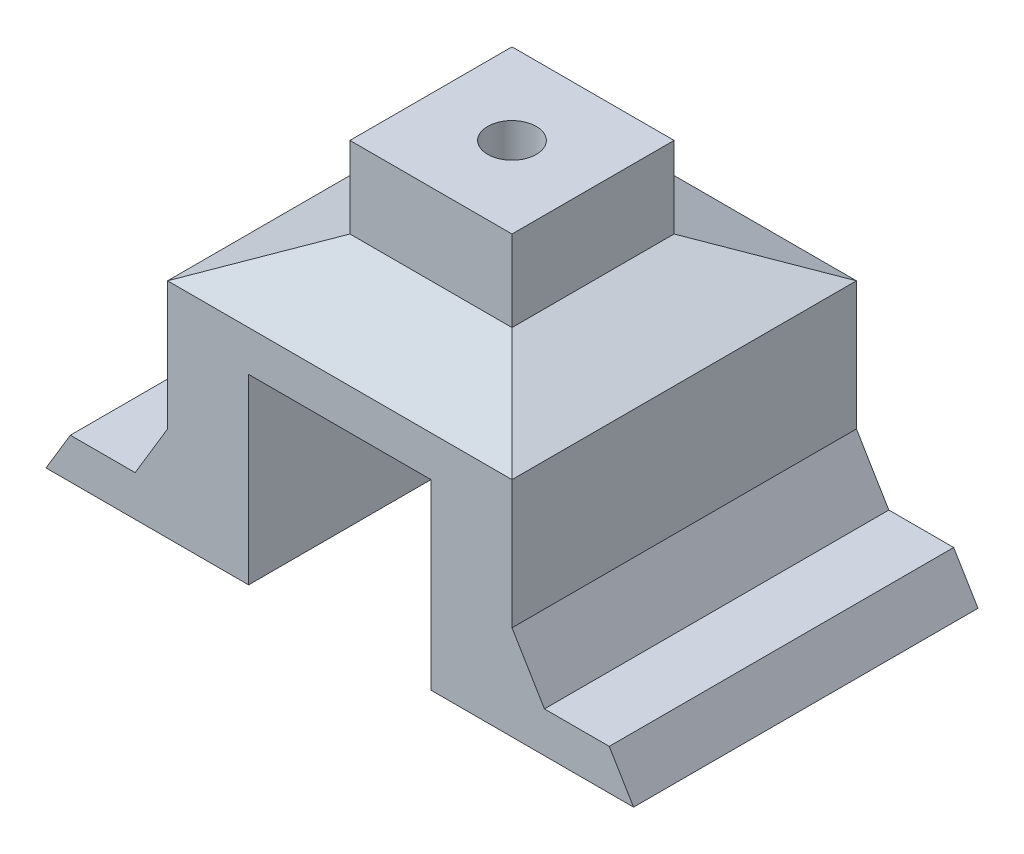
ISO-10303-21;
HEADER;
FILE_DESCRIPTION(('STEP AP214'),'2;1');
FILE_NAME('part.step','',(''),(''),'','','');
FILE_SCHEMA(('AUTOMOTIVE_DESIGN { 1 0 10303 214 1 1 1 1 }'));
ENDSEC;
DATA;
#1=APPLICATION_CONTEXT('core data for automotive mechanical design processes');
#2=APPLICATION_PROTOCOL_DEFINITION('international standard','automotive_design',2000,#1);
#3=PRODUCT_CONTEXT('',#1,'mechanical');
#4=PRODUCT('Part','Part','',(#3));
#5=PRODUCT_RELATED_PRODUCT_CATEGORY('part','',(#4));
#6=PRODUCT_DEFINITION_FORMATION('','',#4);
#7=PRODUCT_DEFINITION_CONTEXT('part definition',#1,'design');
#8=PRODUCT_DEFINITION('design','',#6,#7);
#9=PRODUCT_DEFINITION_SHAPE('','',#8);
#10=(LENGTH_UNIT() NAMED_UNIT(*) SI_UNIT(.MILLI.,.METRE.));
#11=(NAMED_UNIT(*) PLANE_ANGLE_UNIT() SI_UNIT($,.RADIAN.));
#12=(NAMED_UNIT(*) SI_UNIT($,.STERADIAN.) SOLID_ANGLE_UNIT());
#13=UNCERTAINTY_MEASURE_WITH_UNIT(LENGTH_MEASURE(1.E-05),#10,'distance_accuracy_value','');
#14=(GEOMETRIC_REPRESENTATION_CONTEXT(3) GLOBAL_UNCERTAINTY_ASSIGNED_CONTEXT((#13)) GLOBAL_UNIT_ASSIGNED_CONTEXT((#10,
#11,#12)) REPRESENTATION_CONTEXT('',''));
#15=CARTESIAN_POINT('',(0.,0.,0.));
#16=DIRECTION('',(0.,0.,1.));
#17=DIRECTION('',(1.,0.,0.));
#18=AXIS2_PLACEMENT_3D('',#15,#16,#17);
#19=CARTESIAN_POINT('',(-36.25,0.,21.25));
#20=DIRECTION('',(0.,1.,0.));
#21=DIRECTION('',(-1.,0.,0.));
#22=AXIS2_PLACEMENT_3D('',#19,#20,#21);
#23=PLANE('',#22);
#24=DIRECTION('',(1.,0.,0.));
#25=VECTOR('',#24,1.);
#26=CARTESIAN_POINT('',(-36.25,0.,-21.25));
#27=LINE('',#26,#25);
#28=CARTESIAN_POINT('',(-36.25,0.,-21.25));
#29=VERTEX_POINT('',#28);
#30=CARTESIAN_POINT('',(-11.25,0.,-21.25));
#31=VERTEX_POINT('',#30);
#32=EDGE_CURVE('E174',#29,#31,#27,.T.);
#33=ORIENTED_EDGE('',*,*,#32,.T.);
#34=DIRECTION('',(0.,0.,-1.));
#35=VECTOR('',#34,1.);
#36=CARTESIAN_POINT('',(-11.25,0.,21.25));
#37=LINE('',#36,#35);
#38=CARTESIAN_POINT('',(-11.25,0.,21.25));
#39=VERTEX_POINT('',#38);
#40=EDGE_CURVE('E272',#39,#31,#37,.T.);
#41=ORIENTED_EDGE('',*,*,#40,.F.);
#42=DIRECTION('',(1.,0.,0.));
#43=VECTOR('',#42,1.);
#44=CARTESIAN_POINT('',(-36.25,0.,21.25));
#45=LINE('',#44,#43);
#46=CARTESIAN_POINT('',(-36.25,0.,21.25));
#47=VERTEX_POINT('',#46);
#48=EDGE_CURVE('E213',#47,#39,#45,.T.);
#49=ORIENTED_EDGE('',*,*,#48,.F.);
#50=DIRECTION('',(0.,0.,-1.));
#51=VECTOR('',#50,1.);
#52=CARTESIAN_POINT('',(-36.25,0.,21.25));
#53=LINE('',#52,#51);
#54=EDGE_CURVE('E170',#47,#29,#53,.T.);
#55=ORIENTED_EDGE('',*,*,#54,.T.);
#56=EDGE_LOOP('',(#33,#41,#49,#55));
#57=FACE_BOUND('',#56,.T.);
#58=ADVANCED_FACE('F38',(#57),#23,.F.);
#59=CARTESIAN_POINT('',(-11.25,0.,21.25));
#60=DIRECTION('',(-1.,0.,0.));
#61=DIRECTION('',(0.,0.,1.));
#62=AXIS2_PLACEMENT_3D('',#59,#60,#61);
#63=PLANE('',#62);
#64=DIRECTION('',(0.,1.,0.));
#65=VECTOR('',#64,1.);
#66=CARTESIAN_POINT('',(-11.25,0.,-21.25));
#67=LINE('',#66,#65);
#68=CARTESIAN_POINT('',(-11.25,22.5,-21.25));
#69=VERTEX_POINT('',#68);
#70=EDGE_CURVE('E178',#31,#69,#67,.T.);
#71=ORIENTED_EDGE('',*,*,#70,.T.);
#72=DIRECTION('',(0.,0.,-1.));
#73=VECTOR('',#72,1.);
#74=CARTESIAN_POINT('',(-11.25,22.5,21.25));
#75=LINE('',#74,#73);
#76=CARTESIAN_POINT('',(-11.25,22.5,21.25));
#77=VERTEX_POINT('',#76);
#78=EDGE_CURVE('E268',#77,#69,#75,.T.);
#79=ORIENTED_EDGE('',*,*,#78,.F.);
#80=DIRECTION('',(0.,1.,0.));
#81=VECTOR('',#80,1.);
#82=CARTESIAN_POINT('',(-11.25,0.,21.25));
#83=LINE('',#82,#81);
#84=EDGE_CURVE('E115',#39,#77,#83,.T.);
#85=ORIENTED_EDGE('',*,*,#84,.F.);
#86=ORIENTED_EDGE('',*,*,#40,.T.);
#87=EDGE_LOOP('',(#71,#79,#85,#86));
#88=FACE_BOUND('',#87,.T.);
#89=ADVANCED_FACE('F430',(#88),#63,.F.);
#90=CARTESIAN_POINT('',(-11.25,22.5,21.25));
#91=DIRECTION('',(0.,1.,0.));
#92=DIRECTION('',(0.,0.,1.));
#93=AXIS2_PLACEMENT_3D('',#90,#91,#92);
#94=PLANE('',#93);
#95=CARTESIAN_POINT('',(0.,22.5,0.));
#96=DIRECTION('',(0.,1.,0.));
#97=DIRECTION('',(0.,0.,1.));
#98=AXIS2_PLACEMENT_3D('',#95,#96,#97);
#99=CIRCLE('',#98,3.);
#100=CARTESIAN_POINT('',(0.,22.5,3.));
#101=VERTEX_POINT('',#100);
#102=EDGE_CURVE('E325',#101,#101,#99,.T.);
#103=ORIENTED_EDGE('',*,*,#102,.T.);
#104=EDGE_LOOP('',(#103));
#105=FACE_BOUND('',#104,.T.);
#106=DIRECTION('',(1.,0.,0.));
#107=VECTOR('',#106,1.);
#108=CARTESIAN_POINT('',(-11.25,22.5,-21.25));
#109=LINE('',#108,#107);
#110=CARTESIAN_POINT('',(11.25,22.5,-21.25));
#111=VERTEX_POINT('',#110);
#112=EDGE_CURVE('E182',#69,#111,#109,.T.);
#113=ORIENTED_EDGE('',*,*,#112,.T.);
#114=DIRECTION('',(0.,0.,-1.));
#115=VECTOR('',#114,1.);
#116=CARTESIAN_POINT('',(11.25,22.5,21.25));
#117=LINE('',#116,#115);
#118=CARTESIAN_POINT('',(11.25,22.5,21.25));
#119=VERTEX_POINT('',#118);
#120=EDGE_CURVE('E264',#119,#111,#117,.T.);
#121=ORIENTED_EDGE('',*,*,#120,.F.);
#122=DIRECTION('',(1.,0.,0.));
#123=VECTOR('',#122,1.);
#124=CARTESIAN_POINT('',(-11.25,22.5,21.25));
#125=LINE('',#124,#123);
#126=EDGE_CURVE('E351',#77,#119,#125,.T.);
#127=ORIENTED_EDGE('',*,*,#126,.F.);
#128=ORIENTED_EDGE('',*,*,#78,.T.);
#129=EDGE_LOOP('',(#113,#121,#127,#128));
#130=FACE_BOUND('',#129,.T.);
#131=ADVANCED_FACE('F434',(#105,#130),#94,.F.);
#132=CARTESIAN_POINT('',(11.25,22.5,21.25));
#133=DIRECTION('',(1.,0.,0.));
#134=DIRECTION('',(0.,1.,0.));
#135=AXIS2_PLACEMENT_3D('',#132,#133,#134);
#136=PLANE('',#135);
#137=DIRECTION('',(0.,-1.,0.));
#138=VECTOR('',#137,1.);
#139=CARTESIAN_POINT('',(11.25,22.5,-21.25));
#140=LINE('',#139,#138);
#141=CARTESIAN_POINT('',(11.25,0.,-21.25));
#142=VERTEX_POINT('',#141);
#143=EDGE_CURVE('E185',#111,#142,#140,.T.);
#144=ORIENTED_EDGE('',*,*,#143,.T.);
#145=DIRECTION('',(0.,0.,-1.));
#146=VECTOR('',#145,1.);
#147=CARTESIAN_POINT('',(11.25,0.,21.25));
#148=LINE('',#147,#146);
#149=CARTESIAN_POINT('',(11.25,0.,21.25));
#150=VERTEX_POINT('',#149);
#151=EDGE_CURVE('E260',#150,#142,#148,.T.);
#152=ORIENTED_EDGE('',*,*,#151,.F.);
#153=DIRECTION('',(0.,-1.,0.));
#154=VECTOR('',#153,1.);
#155=CARTESIAN_POINT('',(11.25,22.5,21.25));
#156=LINE('',#155,#154);
#157=EDGE_CURVE('E354',#119,#150,#156,.T.);
#158=ORIENTED_EDGE('',*,*,#157,.F.);
#159=ORIENTED_EDGE('',*,*,#120,.T.);
#160=EDGE_LOOP('',(#144,#152,#158,#159));
#161=FACE_BOUND('',#160,.T.);
#162=ADVANCED_FACE('F439',(#161),#136,.F.);
#163=CARTESIAN_POINT('',(11.25,0.,21.25));
#164=DIRECTION('',(0.,1.,0.));
#165=DIRECTION('',(-1.,0.,0.));
#166=AXIS2_PLACEMENT_3D('',#163,#164,#165);
#167=PLANE('',#166);
#168=DIRECTION('',(1.,0.,0.));
#169=VECTOR('',#168,1.);
#170=CARTESIAN_POINT('',(11.25,0.,-21.25));
#171=LINE('',#170,#169);
#172=CARTESIAN_POINT('',(36.25,0.,-21.25));
#173=VERTEX_POINT('',#172);
#174=EDGE_CURVE('E188',#142,#173,#171,.T.);
#175=ORIENTED_EDGE('',*,*,#174,.T.);
#176=DIRECTION('',(0.,0.,-1.));
#177=VECTOR('',#176,1.);
#178=CARTESIAN_POINT('',(36.25,0.,21.25));
#179=LINE('',#178,#177);
#180=CARTESIAN_POINT('',(36.25,0.,21.25));
#181=VERTEX_POINT('',#180);
#182=EDGE_CURVE('E256',#181,#173,#179,.T.);
#183=ORIENTED_EDGE('',*,*,#182,.F.);
#184=DIRECTION('',(1.,0.,0.));
#185=VECTOR('',#184,1.);
#186=CARTESIAN_POINT('',(11.25,0.,21.25));
#187=LINE('',#186,#185);
#188=EDGE_CURVE('E357',#150,#181,#187,.T.);
#189=ORIENTED_EDGE('',*,*,#188,.F.);
#190=ORIENTED_EDGE('',*,*,#151,.T.);
#191=EDGE_LOOP('',(#175,#183,#189,#190));
#192=FACE_BOUND('',#191,.T.);
#193=ADVANCED_FACE('F445',(#192),#167,.F.);
#194=CARTESIAN_POINT('',(36.25,0.,21.25));
#195=DIRECTION('',(-0.857492925712544,-0.514495755427526,0.));
#196=DIRECTION('',(0.514495755427526,-0.857492925712544,0.));
#197=AXIS2_PLACEMENT_3D('',#194,#195,#196);
#198=PLANE('',#197);
#199=DIRECTION('',(-0.514495755427526,0.857492925712544,0.));
#200=VECTOR('',#199,1.);
#201=CARTESIAN_POINT('',(36.25,0.,-21.25));
#202=LINE('',#201,#200);
#203=CARTESIAN_POINT('',(33.25,5.,-21.25));
#204=VERTEX_POINT('',#203);
#205=EDGE_CURVE('E191',#173,#204,#202,.T.);
#206=ORIENTED_EDGE('',*,*,#205,.T.);
#207=DIRECTION('',(0.,0.,-1.));
#208=VECTOR('',#207,1.);
#209=CARTESIAN_POINT('',(33.25,5.,21.25));
#210=LINE('',#209,#208);
#211=CARTESIAN_POINT('',(33.25,5.,21.25));
#212=VERTEX_POINT('',#211);
#213=EDGE_CURVE('E252',#212,#204,#210,.T.);
#214=ORIENTED_EDGE('',*,*,#213,.F.);
#215=DIRECTION('',(-0.514495755427526,0.857492925712544,0.));
#216=VECTOR('',#215,1.);
#217=CARTESIAN_POINT('',(36.25,0.,21.25));
#218=LINE('',#217,#216);
#219=EDGE_CURVE('E360',#181,#212,#218,.T.);
#220=ORIENTED_EDGE('',*,*,#219,.F.);
#221=ORIENTED_EDGE('',*,*,#182,.T.);
#222=EDGE_LOOP('',(#206,#214,#220,#221));
#223=FACE_BOUND('',#222,.T.);
#224=ADVANCED_FACE('F449',(#223),#198,.F.);
#225=CARTESIAN_POINT('',(33.25,5.,21.25));
#226=DIRECTION('',(0.,-1.,0.));
#227=DIRECTION('',(1.,0.,0.));
#228=AXIS2_PLACEMENT_3D('',#225,#226,#227);
#229=PLANE('',#228);
#230=DIRECTION('',(-1.,0.,0.));
#231=VECTOR('',#230,1.);
#232=CARTESIAN_POINT('',(33.25,5.,-21.25));
#233=LINE('',#232,#231);
#234=CARTESIAN_POINT('',(25.25,5.,-21.25));
#235=VERTEX_POINT('',#234);
#236=EDGE_CURVE('E194',#204,#235,#233,.T.);
#237=ORIENTED_EDGE('',*,*,#236,.T.);
#238=DIRECTION('',(0.,0.,-1.));
#239=VECTOR('',#238,1.);
#240=CARTESIAN_POINT('',(25.25,5.,21.25));
#241=LINE('',#240,#239);
#242=CARTESIAN_POINT('',(25.25,5.,21.25));
#243=VERTEX_POINT('',#242);
#244=EDGE_CURVE('E248',#243,#235,#241,.T.);
#245=ORIENTED_EDGE('',*,*,#244,.F.);
#246=DIRECTION('',(-1.,0.,0.));
#247=VECTOR('',#246,1.);
#248=CARTESIAN_POINT('',(33.25,5.,21.25));
#249=LINE('',#248,#247);
#250=EDGE_CURVE('E363',#212,#243,#249,.T.);
#251=ORIENTED_EDGE('',*,*,#250,.F.);
#252=ORIENTED_EDGE('',*,*,#213,.T.);
#253=EDGE_LOOP('',(#237,#245,#251,#252));
#254=FACE_BOUND('',#253,.T.);
#255=ADVANCED_FACE('F453',(#254),#229,.F.);
#256=CARTESIAN_POINT('',(21.25,11.6666666666667,21.25));
#257=DIRECTION('',(-0.857492925712544,-0.514495755427526,0.));
#258=DIRECTION('',(0.514495755427526,-0.857492925712544,0.));
#259=AXIS2_PLACEMENT_3D('',#256,#257,#258);
#260=PLANE('',#259);
#261=DIRECTION('',(-0.514495755427526,0.857492925712544,0.));
#262=VECTOR('',#261,1.);
#263=CARTESIAN_POINT('',(21.25,11.6666666666667,-21.25));
#264=LINE('',#263,#262);
#265=CARTESIAN_POINT('',(21.25,11.6666666666667,-21.25));
#266=VERTEX_POINT('',#265);
#267=EDGE_CURVE('E197',#235,#266,#264,.T.);
#268=ORIENTED_EDGE('',*,*,#267,.T.);
#269=DIRECTION('',(0.,0.,-1.));
#270=VECTOR('',#269,1.);
#271=CARTESIAN_POINT('',(21.25,11.6666666666667,21.25));
#272=LINE('',#271,#270);
#273=CARTESIAN_POINT('',(21.25,11.6666666666667,21.25));
#274=VERTEX_POINT('',#273);
#275=EDGE_CURVE('E244',#274,#266,#272,.T.);
#276=ORIENTED_EDGE('',*,*,#275,.F.);
#277=DIRECTION('',(-0.514495755427526,0.857492925712544,0.));
#278=VECTOR('',#277,1.);
#279=CARTESIAN_POINT('',(21.25,11.6666666666667,21.25));
#280=LINE('',#279,#278);
#281=EDGE_CURVE('E366',#243,#274,#280,.T.);
#282=ORIENTED_EDGE('',*,*,#281,.F.);
#283=ORIENTED_EDGE('',*,*,#244,.T.);
#284=EDGE_LOOP('',(#268,#276,#282,#283));
#285=FACE_BOUND('',#284,.T.);
#286=ADVANCED_FACE('F457',(#285),#260,.F.);
#287=CARTESIAN_POINT('',(21.25,11.6666666666667,21.25));
#288=DIRECTION('',(-1.,0.,0.));
#289=DIRECTION('',(0.,0.,1.));
#290=AXIS2_PLACEMENT_3D('',#287,#288,#289);
#291=PLANE('',#290);
#292=DIRECTION('',(0.,1.,0.));
#293=VECTOR('',#292,1.);
#294=CARTESIAN_POINT('',(21.25,11.6666666666667,-21.25));
#295=LINE('',#294,#293);
#296=CARTESIAN_POINT('',(21.25,27.5,-21.25));
#297=VERTEX_POINT('',#296);
#298=EDGE_CURVE('E200',#266,#297,#295,.T.);
#299=ORIENTED_EDGE('',*,*,#298,.T.);
#300=DIRECTION('',(0.,0.,-1.));
#301=VECTOR('',#300,1.);
#302=CARTESIAN_POINT('',(21.25,27.5,21.25));
#303=LINE('',#302,#301);
#304=CARTESIAN_POINT('',(21.25,27.5,21.25));
#305=VERTEX_POINT('',#304);
#306=EDGE_CURVE('E240',#305,#297,#303,.T.);
#307=ORIENTED_EDGE('',*,*,#306,.F.);
#308=DIRECTION('',(0.,1.,0.));
#309=VECTOR('',#308,1.);
#310=CARTESIAN_POINT('',(21.25,11.6666666666667,21.25));
#311=LINE('',#310,#309);
#312=EDGE_CURVE('E369',#274,#305,#311,.T.);
#313=ORIENTED_EDGE('',*,*,#312,.F.);
#314=ORIENTED_EDGE('',*,*,#275,.T.);
#315=EDGE_LOOP('',(#299,#307,#313,#314));
#316=FACE_BOUND('',#315,.T.);
#317=ADVANCED_FACE('F381',(#316),#291,.F.);
#318=CARTESIAN_POINT('',(21.25,27.5,21.25));
#319=DIRECTION('',(-0.406138466053447,-0.913811548620257,0.));
#320=DIRECTION('',(0.913811548620257,-0.406138466053447,0.));
#321=AXIS2_PLACEMENT_3D('',#318,#319,#320);
#322=PLANE('',#321);
#323=ORIENTED_EDGE('',*,*,#306,.T.);
#324=DIRECTION('',(-0.674578520096276,0.299812675598344,0.674578520096275));
#325=VECTOR('',#324,1.);
#326=CARTESIAN_POINT('',(1.91011235955056,36.0955056179775,-1.91011235955056));
#327=LINE('',#326,#325);
#328=CARTESIAN_POINT('',(10.,32.5,-10.));
#329=VERTEX_POINT('',#328);
#330=EDGE_CURVE('E329',#297,#329,#327,.T.);
#331=ORIENTED_EDGE('',*,*,#330,.T.);
#332=DIRECTION('',(0.,0.,-1.));
#333=VECTOR('',#332,1.);
#334=CARTESIAN_POINT('',(10.,32.5,21.25));
#335=LINE('',#334,#333);
#336=CARTESIAN_POINT('',(10.,32.5,10.));
#337=VERTEX_POINT('',#336);
#338=EDGE_CURVE('E236',#337,#329,#335,.T.);
#339=ORIENTED_EDGE('',*,*,#338,.F.);
#340=DIRECTION('',(0.674578520096276,-0.299812675598344,0.674578520096275));
#341=VECTOR('',#340,1.);
#342=CARTESIAN_POINT('',(21.25,27.5,21.25));
#343=LINE('',#342,#341);
#344=EDGE_CURVE('E337',#337,#305,#343,.T.);
#345=ORIENTED_EDGE('',*,*,#344,.T.);
#346=EDGE_LOOP('',(#323,#331,#339,#345));
#347=FACE_BOUND('',#346,.T.);
#348=ADVANCED_FACE('F384',(#347),#322,.F.);
#349=CARTESIAN_POINT('',(10.,32.5,21.25));
#350=DIRECTION('',(-1.,0.,0.));
#351=DIRECTION('',(0.,0.,1.));
#352=AXIS2_PLACEMENT_3D('',#349,#350,#351);
#353=PLANE('',#352);
#354=ORIENTED_EDGE('',*,*,#338,.T.);
#355=DIRECTION('',(0.,1.,0.));
#356=VECTOR('',#355,1.);
#357=CARTESIAN_POINT('',(10.,32.5,-10.));
#358=LINE('',#357,#356);
#359=CARTESIAN_POINT('',(10.,42.5,-10.));
#360=VERTEX_POINT('',#359);
#361=EDGE_CURVE('E179',#329,#360,#358,.T.);
#362=ORIENTED_EDGE('',*,*,#361,.T.);
#363=DIRECTION('',(0.,0.,-1.));
#364=VECTOR('',#363,1.);
#365=CARTESIAN_POINT('',(10.,42.5,21.25));
#366=LINE('',#365,#364);
#367=CARTESIAN_POINT('',(10.,42.5,10.));
#368=VERTEX_POINT('',#367);
#369=EDGE_CURVE('E232',#368,#360,#366,.T.);
#370=ORIENTED_EDGE('',*,*,#369,.F.);
#371=DIRECTION('',(0.,-1.,0.));
#372=VECTOR('',#371,1.);
#373=CARTESIAN_POINT('',(10.,32.5,10.));
#374=LINE('',#373,#372);
#375=EDGE_CURVE('E341',#368,#337,#374,.T.);
#376=ORIENTED_EDGE('',*,*,#375,.T.);
#377=EDGE_LOOP('',(#354,#362,#370,#376));
#378=FACE_BOUND('',#377,.T.);
#379=ADVANCED_FACE('F394',(#378),#353,.F.);
#380=CARTESIAN_POINT('',(10.,42.5,21.25));
#381=DIRECTION('',(0.,-1.,0.));
#382=DIRECTION('',(0.,0.,-1.));
#383=AXIS2_PLACEMENT_3D('',#380,#381,#382);
#384=PLANE('',#383);
#385=CARTESIAN_POINT('',(0.,42.5,0.));
#386=DIRECTION('',(0.,1.,0.));
#387=DIRECTION('',(0.,0.,1.));
#388=AXIS2_PLACEMENT_3D('',#385,#386,#387);
#389=CIRCLE('',#388,3.);
#390=CARTESIAN_POINT('',(0.,42.5,3.));
#391=VERTEX_POINT('',#390);
#392=EDGE_CURVE('E595',#391,#391,#389,.T.);
#393=ORIENTED_EDGE('',*,*,#392,.F.);
#394=EDGE_LOOP('',(#393));
#395=FACE_BOUND('',#394,.T.);
#396=ORIENTED_EDGE('',*,*,#369,.T.);
#397=DIRECTION('',(1.,0.,0.));
#398=VECTOR('',#397,1.);
#399=CARTESIAN_POINT('',(-36.25,42.5,-10.));
#400=LINE('',#399,#398);
#401=CARTESIAN_POINT('',(-10.,42.5,-10.));
#402=VERTEX_POINT('',#401);
#403=EDGE_CURVE('E304',#402,#360,#400,.T.);
#404=ORIENTED_EDGE('',*,*,#403,.F.);
#405=DIRECTION('',(0.,0.,-1.));
#406=VECTOR('',#405,1.);
#407=CARTESIAN_POINT('',(-10.,42.5,21.25));
#408=LINE('',#407,#406);
#409=CARTESIAN_POINT('',(-10.,42.5,10.));
#410=VERTEX_POINT('',#409);
#411=EDGE_CURVE('E228',#410,#402,#408,.T.);
#412=ORIENTED_EDGE('',*,*,#411,.F.);
#413=DIRECTION('',(1.,0.,0.));
#414=VECTOR('',#413,1.);
#415=CARTESIAN_POINT('',(-36.25,42.5,10.));
#416=LINE('',#415,#414);
#417=EDGE_CURVE('E301',#410,#368,#416,.T.);
#418=ORIENTED_EDGE('',*,*,#417,.T.);
#419=EDGE_LOOP('',(#396,#404,#412,#418));
#420=FACE_BOUND('',#419,.T.);
#421=ADVANCED_FACE('F300',(#395,#420),#384,.F.);
#422=CARTESIAN_POINT('',(-10.,42.5,21.25));
#423=DIRECTION('',(1.,0.,0.));
#424=DIRECTION('',(0.,0.,-1.));
#425=AXIS2_PLACEMENT_3D('',#422,#423,#424);
#426=PLANE('',#425);
#427=ORIENTED_EDGE('',*,*,#411,.T.);
#428=DIRECTION('',(0.,-1.,0.));
#429=VECTOR('',#428,1.);
#430=CARTESIAN_POINT('',(-10.,42.5,-10.));
#431=LINE('',#430,#429);
#432=CARTESIAN_POINT('',(-9.99999999999999,32.5,-10.));
#433=VERTEX_POINT('',#432);
#434=EDGE_CURVE('E11',#402,#433,#431,.T.);
#435=ORIENTED_EDGE('',*,*,#434,.T.);
#436=DIRECTION('',(0.,0.,-1.));
#437=VECTOR('',#436,1.);
#438=CARTESIAN_POINT('',(-10.,32.5,21.25));
#439=LINE('',#438,#437);
#440=CARTESIAN_POINT('',(-10.,32.5,10.));
#441=VERTEX_POINT('',#440);
#442=EDGE_CURVE('E224',#441,#433,#439,.T.);
#443=ORIENTED_EDGE('',*,*,#442,.F.);
#444=DIRECTION('',(0.,1.,0.));
#445=VECTOR('',#444,1.);
#446=CARTESIAN_POINT('',(-10.,42.5,10.));
#447=LINE('',#446,#445);
#448=EDGE_CURVE('E47',#441,#410,#447,.T.);
#449=ORIENTED_EDGE('',*,*,#448,.T.);
#450=EDGE_LOOP('',(#427,#435,#443,#449));
#451=FACE_BOUND('',#450,.T.);
#452=ADVANCED_FACE('F289',(#451),#426,.F.);
#453=CARTESIAN_POINT('',(-10.,32.5,21.25));
#454=DIRECTION('',(0.406138466053447,-0.913811548620257,0.));
#455=DIRECTION('',(0.913811548620257,0.406138466053447,0.));
#456=AXIS2_PLACEMENT_3D('',#453,#454,#455);
#457=PLANE('',#456);
#458=ORIENTED_EDGE('',*,*,#442,.T.);
#459=DIRECTION('',(-0.674578520096276,-0.299812675598344,-0.674578520096275));
#460=VECTOR('',#459,1.);
#461=CARTESIAN_POINT('',(4.22050561797753,38.8202247191011,4.22050561797753));
#462=LINE('',#461,#460);
#463=CARTESIAN_POINT('',(-21.25,27.5,-21.25));
#464=VERTEX_POINT('',#463);
#465=EDGE_CURVE('E317',#433,#464,#462,.T.);
#466=ORIENTED_EDGE('',*,*,#465,.T.);
#467=DIRECTION('',(0.,0.,-1.));
#468=VECTOR('',#467,1.);
#469=CARTESIAN_POINT('',(-21.25,27.5,21.25));
#470=LINE('',#469,#468);
#471=CARTESIAN_POINT('',(-21.25,27.5,21.25));
#472=VERTEX_POINT('',#471);
#473=EDGE_CURVE('E220',#472,#464,#470,.T.);
#474=ORIENTED_EDGE('',*,*,#473,.F.);
#475=DIRECTION('',(0.674578520096276,0.299812675598344,-0.674578520096275));
#476=VECTOR('',#475,1.);
#477=CARTESIAN_POINT('',(-15.1193820224719,30.2247191011236,15.1193820224719));
#478=LINE('',#477,#476);
#479=EDGE_CURVE('E333',#472,#441,#478,.T.);
#480=ORIENTED_EDGE('',*,*,#479,.T.);
#481=EDGE_LOOP('',(#458,#466,#474,#480));
#482=FACE_BOUND('',#481,.T.);
#483=ADVANCED_FACE('F407',(#482),#457,.F.);
#484=CARTESIAN_POINT('',(-21.25,27.5,21.25));
#485=DIRECTION('',(1.,0.,0.));
#486=DIRECTION('',(0.,0.,-1.));
#487=AXIS2_PLACEMENT_3D('',#484,#485,#486);
#488=PLANE('',#487);
#489=DIRECTION('',(0.,-1.,0.));
#490=VECTOR('',#489,1.);
#491=CARTESIAN_POINT('',(-21.25,27.5,-21.25));
#492=LINE('',#491,#490);
#493=CARTESIAN_POINT('',(-21.25,11.6666666666667,-21.25));
#494=VERTEX_POINT('',#493);
#495=EDGE_CURVE('E204',#464,#494,#492,.T.);
#496=ORIENTED_EDGE('',*,*,#495,.T.);
#497=DIRECTION('',(0.,0.,-1.));
#498=VECTOR('',#497,1.);
#499=CARTESIAN_POINT('',(-21.25,11.6666666666667,21.25));
#500=LINE('',#499,#498);
#501=CARTESIAN_POINT('',(-21.25,11.6666666666667,21.25));
#502=VERTEX_POINT('',#501);
#503=EDGE_CURVE('E163',#502,#494,#500,.T.);
#504=ORIENTED_EDGE('',*,*,#503,.F.);
#505=DIRECTION('',(0.,-1.,0.));
#506=VECTOR('',#505,1.);
#507=CARTESIAN_POINT('',(-21.25,27.5,21.25));
#508=LINE('',#507,#506);
#509=EDGE_CURVE('E152',#472,#502,#508,.T.);
#510=ORIENTED_EDGE('',*,*,#509,.F.);
#511=ORIENTED_EDGE('',*,*,#473,.T.);
#512=EDGE_LOOP('',(#496,#504,#510,#511));
#513=FACE_BOUND('',#512,.T.);
#514=ADVANCED_FACE('F411',(#513),#488,.F.);
#515=CARTESIAN_POINT('',(-25.25,5.,21.25));
#516=DIRECTION('',(0.857492925712544,-0.514495755427526,0.));
#517=DIRECTION('',(0.514495755427526,0.857492925712544,0.));
#518=AXIS2_PLACEMENT_3D('',#515,#516,#517);
#519=PLANE('',#518);
#520=DIRECTION('',(-0.514495755427526,-0.857492925712544,0.));
#521=VECTOR('',#520,1.);
#522=CARTESIAN_POINT('',(-25.25,5.,-21.25));
#523=LINE('',#522,#521);
#524=CARTESIAN_POINT('',(-25.25,5.,-21.25));
#525=VERTEX_POINT('',#524);
#526=EDGE_CURVE('E161',#494,#525,#523,.T.);
#527=ORIENTED_EDGE('',*,*,#526,.T.);
#528=DIRECTION('',(0.,0.,-1.));
#529=VECTOR('',#528,1.);
#530=CARTESIAN_POINT('',(-25.25,5.,21.25));
#531=LINE('',#530,#529);
#532=CARTESIAN_POINT('',(-25.25,5.,21.25));
#533=VERTEX_POINT('',#532);
#534=EDGE_CURVE('E158',#533,#525,#531,.T.);
#535=ORIENTED_EDGE('',*,*,#534,.F.);
#536=DIRECTION('',(-0.514495755427526,-0.857492925712544,0.));
#537=VECTOR('',#536,1.);
#538=CARTESIAN_POINT('',(-25.25,5.,21.25));
#539=LINE('',#538,#537);
#540=EDGE_CURVE('E145',#502,#533,#539,.T.);
#541=ORIENTED_EDGE('',*,*,#540,.F.);
#542=ORIENTED_EDGE('',*,*,#503,.T.);
#543=EDGE_LOOP('',(#527,#535,#541,#542));
#544=FACE_BOUND('',#543,.T.);
#545=ADVANCED_FACE('F159',(#544),#519,.F.);
#546=CARTESIAN_POINT('',(-25.25,5.,21.25));
#547=DIRECTION('',(0.,-1.,0.));
#548=DIRECTION('',(1.,0.,0.));
#549=AXIS2_PLACEMENT_3D('',#546,#547,#548);
#550=PLANE('',#549);
#551=DIRECTION('',(-1.,0.,0.));
#552=VECTOR('',#551,1.);
#553=CARTESIAN_POINT('',(-25.25,5.,-21.25));
#554=LINE('',#553,#552);
#555=CARTESIAN_POINT('',(-33.25,5.,-21.25));
#556=VERTEX_POINT('',#555);
#557=EDGE_CURVE('E100',#525,#556,#554,.T.);
#558=ORIENTED_EDGE('',*,*,#557,.T.);
#559=DIRECTION('',(0.,0.,-1.));
#560=VECTOR('',#559,1.);
#561=CARTESIAN_POINT('',(-33.25,5.,21.25));
#562=LINE('',#561,#560);
#563=CARTESIAN_POINT('',(-33.25,5.,21.25));
#564=VERTEX_POINT('',#563);
#565=EDGE_CURVE('E164',#564,#556,#562,.T.);
#566=ORIENTED_EDGE('',*,*,#565,.F.);
#567=DIRECTION('',(-1.,0.,0.));
#568=VECTOR('',#567,1.);
#569=CARTESIAN_POINT('',(-25.25,5.,21.25));
#570=LINE('',#569,#568);
#571=EDGE_CURVE('E150',#533,#564,#570,.T.);
#572=ORIENTED_EDGE('',*,*,#571,.F.);
#573=ORIENTED_EDGE('',*,*,#534,.T.);
#574=EDGE_LOOP('',(#558,#566,#572,#573));
#575=FACE_BOUND('',#574,.T.);
#576=ADVANCED_FACE('F166',(#575),#550,.F.);
#577=CARTESIAN_POINT('',(-33.25,5.,21.25));
#578=DIRECTION('',(0.857492925712544,-0.514495755427526,0.));
#579=DIRECTION('',(0.514495755427526,0.857492925712544,0.));
#580=AXIS2_PLACEMENT_3D('',#577,#578,#579);
#581=PLANE('',#580);
#582=DIRECTION('',(-0.514495755427526,-0.857492925712544,0.));
#583=VECTOR('',#582,1.);
#584=CARTESIAN_POINT('',(-33.25,5.,-21.25));
#585=LINE('',#584,#583);
#586=EDGE_CURVE('E106',#556,#29,#585,.T.);
#587=ORIENTED_EDGE('',*,*,#586,.T.);
#588=ORIENTED_EDGE('',*,*,#54,.F.);
#589=DIRECTION('',(-0.514495755427526,-0.857492925712544,0.));
#590=VECTOR('',#589,1.);
#591=CARTESIAN_POINT('',(-33.25,5.,21.25));
#592=LINE('',#591,#590);
#593=EDGE_CURVE('E55',#564,#47,#592,.T.);
#594=ORIENTED_EDGE('',*,*,#593,.F.);
#595=ORIENTED_EDGE('',*,*,#565,.T.);
#596=EDGE_LOOP('',(#587,#588,#594,#595));
#597=FACE_BOUND('',#596,.T.);
#598=ADVANCED_FACE('F419',(#597),#581,.F.);
#599=CARTESIAN_POINT('',(0.,0.,21.25));
#600=DIRECTION('',(0.,0.,1.));
#601=DIRECTION('',(1.,0.,0.));
#602=AXIS2_PLACEMENT_3D('',#599,#600,#601);
#603=PLANE('',#602);
#604=DIRECTION('',(1.,0.,0.));
#605=VECTOR('',#604,1.);
#606=CARTESIAN_POINT('',(0.,27.5,21.25));
#607=LINE('',#606,#605);
#608=EDGE_CURVE('E279',#472,#305,#607,.T.);
#609=ORIENTED_EDGE('',*,*,#608,.F.);
#610=ORIENTED_EDGE('',*,*,#509,.T.);
#611=ORIENTED_EDGE('',*,*,#540,.T.);
#612=ORIENTED_EDGE('',*,*,#571,.T.);
#613=ORIENTED_EDGE('',*,*,#593,.T.);
#614=ORIENTED_EDGE('',*,*,#48,.T.);
#615=ORIENTED_EDGE('',*,*,#84,.T.);
#616=ORIENTED_EDGE('',*,*,#126,.T.);
#617=ORIENTED_EDGE('',*,*,#157,.T.);
#618=ORIENTED_EDGE('',*,*,#188,.T.);
#619=ORIENTED_EDGE('',*,*,#219,.T.);
#620=ORIENTED_EDGE('',*,*,#250,.T.);
#621=ORIENTED_EDGE('',*,*,#281,.T.);
#622=ORIENTED_EDGE('',*,*,#312,.T.);
#623=EDGE_LOOP('',(#609,#610,#611,#612,#613,#614,#615,#616,#617,#618,#619,#620,#621,#622));
#624=FACE_BOUND('',#623,.T.);
#625=ADVANCED_FACE('F148',(#624),#603,.T.);
#626=CARTESIAN_POINT('',(0.,0.,-21.25));
#627=DIRECTION('',(0.,0.,1.));
#628=DIRECTION('',(1.,0.,0.));
#629=AXIS2_PLACEMENT_3D('',#626,#627,#628);
#630=PLANE('',#629);
#631=ORIENTED_EDGE('',*,*,#495,.F.);
#632=DIRECTION('',(1.,0.,0.));
#633=VECTOR('',#632,1.);
#634=CARTESIAN_POINT('',(0.,27.5,-21.25));
#635=LINE('',#634,#633);
#636=EDGE_CURVE('E275',#464,#297,#635,.T.);
#637=ORIENTED_EDGE('',*,*,#636,.T.);
#638=ORIENTED_EDGE('',*,*,#298,.F.);
#639=ORIENTED_EDGE('',*,*,#267,.F.);
#640=ORIENTED_EDGE('',*,*,#236,.F.);
#641=ORIENTED_EDGE('',*,*,#205,.F.);
#642=ORIENTED_EDGE('',*,*,#174,.F.);
#643=ORIENTED_EDGE('',*,*,#143,.F.);
#644=ORIENTED_EDGE('',*,*,#112,.F.);
#645=ORIENTED_EDGE('',*,*,#70,.F.);
#646=ORIENTED_EDGE('',*,*,#32,.F.);
#647=ORIENTED_EDGE('',*,*,#586,.F.);
#648=ORIENTED_EDGE('',*,*,#557,.F.);
#649=ORIENTED_EDGE('',*,*,#526,.F.);
#650=EDGE_LOOP('',(#631,#637,#638,#639,#640,#641,#642,#643,#644,#645,#646,#647,#648,#649));
#651=FACE_BOUND('',#650,.T.);
#652=ADVANCED_FACE('F413',(#651),#630,.F.);
#653=CARTESIAN_POINT('',(-36.25,32.5,-10.));
#654=DIRECTION('',(0.,0.,1.));
#655=DIRECTION('',(0.,-1.,0.));
#656=AXIS2_PLACEMENT_3D('',#653,#654,#655);
#657=PLANE('',#656);
#658=DIRECTION('',(1.,0.,0.));
#659=VECTOR('',#658,1.);
#660=CARTESIAN_POINT('',(-36.25,32.5,-10.));
#661=LINE('',#660,#659);
#662=EDGE_CURVE('E312',#433,#329,#661,.T.);
#663=ORIENTED_EDGE('',*,*,#662,.F.);
#664=ORIENTED_EDGE('',*,*,#434,.F.);
#665=ORIENTED_EDGE('',*,*,#403,.T.);
#666=ORIENTED_EDGE('',*,*,#361,.F.);
#667=EDGE_LOOP('',(#663,#664,#665,#666));
#668=FACE_BOUND('',#667,.T.);
#669=ADVANCED_FACE('F398',(#668),#657,.F.);
#670=CARTESIAN_POINT('',(-36.25,27.5,-21.25));
#671=DIRECTION('',(0.,-0.913811548620257,0.406138466053447));
#672=DIRECTION('',(0.,-0.406138466053447,-0.913811548620257));
#673=AXIS2_PLACEMENT_3D('',#670,#671,#672);
#674=PLANE('',#673);
#675=ORIENTED_EDGE('',*,*,#636,.F.);
#676=ORIENTED_EDGE('',*,*,#465,.F.);
#677=ORIENTED_EDGE('',*,*,#662,.T.);
#678=ORIENTED_EDGE('',*,*,#330,.F.);
#679=EDGE_LOOP('',(#675,#676,#677,#678));
#680=FACE_BOUND('',#679,.T.);
#681=ADVANCED_FACE('F404',(#680),#674,.F.);
#682=CARTESIAN_POINT('',(-36.25,42.5,10.));
#683=DIRECTION('',(0.,0.,-1.));
#684=DIRECTION('',(0.,1.,0.));
#685=AXIS2_PLACEMENT_3D('',#682,#683,#684);
#686=PLANE('',#685);
#687=ORIENTED_EDGE('',*,*,#417,.F.);
#688=ORIENTED_EDGE('',*,*,#448,.F.);
#689=DIRECTION('',(1.,0.,0.));
#690=VECTOR('',#689,1.);
#691=CARTESIAN_POINT('',(-36.25,32.5,10.));
#692=LINE('',#691,#690);
#693=EDGE_CURVE('E319',#441,#337,#692,.T.);
#694=ORIENTED_EDGE('',*,*,#693,.T.);
#695=ORIENTED_EDGE('',*,*,#375,.F.);
#696=EDGE_LOOP('',(#687,#688,#694,#695));
#697=FACE_BOUND('',#696,.T.);
#698=ADVANCED_FACE('F392',(#697),#686,.F.);
#699=CARTESIAN_POINT('',(-36.25,32.5,10.));
#700=DIRECTION('',(0.,-0.913811548620257,-0.406138466053447));
#701=DIRECTION('',(0.,0.406138466053447,-0.913811548620257));
#702=AXIS2_PLACEMENT_3D('',#699,#700,#701);
#703=PLANE('',#702);
#704=ORIENTED_EDGE('',*,*,#693,.F.);
#705=ORIENTED_EDGE('',*,*,#479,.F.);
#706=ORIENTED_EDGE('',*,*,#608,.T.);
#707=ORIENTED_EDGE('',*,*,#344,.F.);
#708=EDGE_LOOP('',(#704,#705,#706,#707));
#709=FACE_BOUND('',#708,.T.);
#710=ADVANCED_FACE('F389',(#709),#703,.F.);
#711=CARTESIAN_POINT('',(0.,0.,0.));
#712=DIRECTION('',(0.,1.,0.));
#713=DIRECTION('',(0.,0.,1.));
#714=AXIS2_PLACEMENT_3D('',#711,#712,#713);
#715=CYLINDRICAL_SURFACE('',#714,3.);
#716=ORIENTED_EDGE('',*,*,#392,.T.);
#717=EDGE_LOOP('',(#716));
#718=FACE_BOUND('',#717,.T.);
#719=ORIENTED_EDGE('',*,*,#102,.F.);
#720=EDGE_LOOP('',(#719));
#721=FACE_BOUND('',#720,.T.);
#722=ADVANCED_FACE('F573',(#718,#721),#715,.F.);
#723=CLOSED_SHELL('',(#58,#89,#131,#162,#193,#224,#255,#286,#317,#348,#379,#421,#452,#483,#514,
#545,#576,#598,#625,#652,#669,#681,#698,#710,#722));
#724=MANIFOLD_SOLID_BREP('B2',#723);
#725=ADVANCED_BREP_SHAPE_REPRESENTATION('',(#18,#724),#14);
#726=SHAPE_DEFINITION_REPRESENTATION(#9,#725);
ENDSEC;
END-ISO-10303-21;
